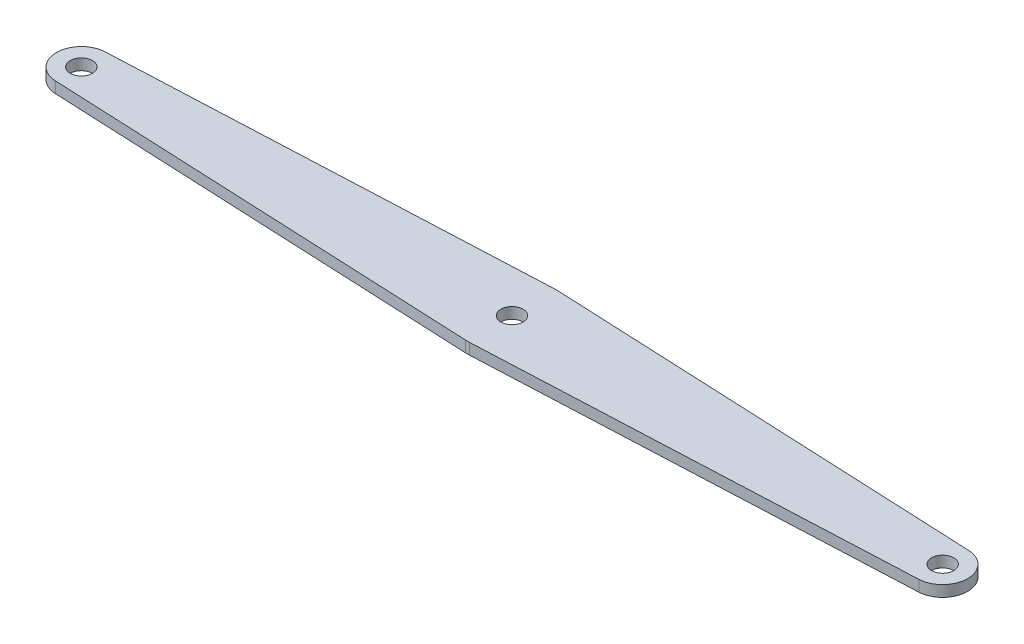
ISO-10303-21;
HEADER;
FILE_DESCRIPTION(('STEP AP214'),'2;1');
FILE_NAME('part.step','',(''),(''),'','','');
FILE_SCHEMA(('AUTOMOTIVE_DESIGN { 1 0 10303 214 1 1 1 1 }'));
ENDSEC;
DATA;
#1=APPLICATION_CONTEXT('core data for automotive mechanical design processes');
#2=APPLICATION_PROTOCOL_DEFINITION('international standard','automotive_design',2000,#1);
#3=PRODUCT_CONTEXT('',#1,'mechanical');
#4=PRODUCT('Part','Part','',(#3));
#5=PRODUCT_RELATED_PRODUCT_CATEGORY('part','',(#4));
#6=PRODUCT_DEFINITION_FORMATION('','',#4);
#7=PRODUCT_DEFINITION_CONTEXT('part definition',#1,'design');
#8=PRODUCT_DEFINITION('design','',#6,#7);
#9=PRODUCT_DEFINITION_SHAPE('','',#8);
#10=(LENGTH_UNIT() NAMED_UNIT(*) SI_UNIT(.MILLI.,.METRE.));
#11=(NAMED_UNIT(*) PLANE_ANGLE_UNIT() SI_UNIT($,.RADIAN.));
#12=(NAMED_UNIT(*) SI_UNIT($,.STERADIAN.) SOLID_ANGLE_UNIT());
#13=UNCERTAINTY_MEASURE_WITH_UNIT(LENGTH_MEASURE(1.E-05),#10,'distance_accuracy_value','');
#14=(GEOMETRIC_REPRESENTATION_CONTEXT(3) GLOBAL_UNCERTAINTY_ASSIGNED_CONTEXT((#13)) GLOBAL_UNIT_ASSIGNED_CONTEXT((#10,
#11,#12)) REPRESENTATION_CONTEXT('',''));
#15=CARTESIAN_POINT('',(0.,0.,0.));
#16=DIRECTION('',(0.,0.,1.));
#17=DIRECTION('',(1.,0.,0.));
#18=AXIS2_PLACEMENT_3D('',#15,#16,#17);
#19=CARTESIAN_POINT('',(-77.5,2.,0.));
#20=DIRECTION('',(0.,-1.,0.));
#21=DIRECTION('',(0.,0.,-1.));
#22=AXIS2_PLACEMENT_3D('',#19,#20,#21);
#23=CYLINDRICAL_SURFACE('',#22,4.5);
#24=CARTESIAN_POINT('',(-77.5,0.,0.));
#25=DIRECTION('',(0.,1.,0.));
#26=DIRECTION('',(0.,0.,1.));
#27=AXIS2_PLACEMENT_3D('',#24,#25,#26);
#28=CIRCLE('',#27,4.5);
#29=CARTESIAN_POINT('',(-77.7032258064516,0.,-4.49540868793841));
#30=VERTEX_POINT('',#29);
#31=CARTESIAN_POINT('',(-77.7032258064516,0.,4.49540868793841));
#32=VERTEX_POINT('',#31);
#33=EDGE_CURVE('E137',#30,#32,#28,.T.);
#34=ORIENTED_EDGE('',*,*,#33,.T.);
#35=DIRECTION('',(0.,-1.,0.));
#36=VECTOR('',#35,1.);
#37=CARTESIAN_POINT('',(-77.7032258064516,2.,4.49540868793841));
#38=LINE('',#37,#36);
#39=CARTESIAN_POINT('',(-77.7032258064516,2.,4.49540868793841));
#40=VERTEX_POINT('',#39);
#41=EDGE_CURVE('E11',#40,#32,#38,.T.);
#42=ORIENTED_EDGE('',*,*,#41,.F.);
#43=CARTESIAN_POINT('',(-77.5,2.,0.));
#44=DIRECTION('',(0.,1.,0.));
#45=DIRECTION('',(0.,0.,1.));
#46=AXIS2_PLACEMENT_3D('',#43,#44,#45);
#47=CIRCLE('',#46,4.5);
#48=CARTESIAN_POINT('',(-77.7032258064516,2.,-4.49540868793841));
#49=VERTEX_POINT('',#48);
#50=EDGE_CURVE('E152',#49,#40,#47,.T.);
#51=ORIENTED_EDGE('',*,*,#50,.F.);
#52=DIRECTION('',(0.,-1.,0.));
#53=VECTOR('',#52,1.);
#54=CARTESIAN_POINT('',(-77.7032258064516,2.,-4.49540868793841));
#55=LINE('',#54,#53);
#56=EDGE_CURVE('E133',#49,#30,#55,.T.);
#57=ORIENTED_EDGE('',*,*,#56,.T.);
#58=EDGE_LOOP('',(#34,#42,#51,#57));
#59=FACE_BOUND('',#58,.T.);
#60=ADVANCED_FACE('F41',(#59),#23,.T.);
#61=CARTESIAN_POINT('',(-77.7032258064516,2.,4.49540868793841));
#62=DIRECTION('',(0.0451612903225806,0.,-0.998979708430757));
#63=DIRECTION('',(-0.998979708430757,0.,-0.0451612903225806));
#64=AXIS2_PLACEMENT_3D('',#61,#62,#63);
#65=PLANE('',#64);
#66=DIRECTION('',(0.998979708430757,0.,0.0451612903225806));
#67=VECTOR('',#66,1.);
#68=CARTESIAN_POINT('',(-77.7032258064516,0.,4.49540868793841));
#69=LINE('',#68,#67);
#70=CARTESIAN_POINT('',(-0.361290322580645,0.,7.99183766744605));
#71=VERTEX_POINT('',#70);
#72=EDGE_CURVE('E140',#32,#71,#69,.T.);
#73=ORIENTED_EDGE('',*,*,#72,.T.);
#74=DIRECTION('',(0.,-1.,0.));
#75=VECTOR('',#74,1.);
#76=CARTESIAN_POINT('',(-0.361290322580645,2.,7.99183766744605));
#77=LINE('',#76,#75);
#78=CARTESIAN_POINT('',(-0.361290322580645,2.,7.99183766744605));
#79=VERTEX_POINT('',#78);
#80=EDGE_CURVE('E49',#79,#71,#77,.T.);
#81=ORIENTED_EDGE('',*,*,#80,.F.);
#82=DIRECTION('',(0.998979708430757,0.,0.0451612903225806));
#83=VECTOR('',#82,1.);
#84=CARTESIAN_POINT('',(-77.7032258064516,2.,4.49540868793841));
#85=LINE('',#84,#83);
#86=EDGE_CURVE('E100',#40,#79,#85,.T.);
#87=ORIENTED_EDGE('',*,*,#86,.F.);
#88=ORIENTED_EDGE('',*,*,#41,.T.);
#89=EDGE_LOOP('',(#73,#81,#87,#88));
#90=FACE_BOUND('',#89,.T.);
#91=ADVANCED_FACE('F233',(#90),#65,.F.);
#92=CARTESIAN_POINT('',(-0.361290322580645,2.,7.99183766744605));
#93=DIRECTION('',(0.,0.,-1.));
#94=DIRECTION('',(-1.,0.,0.));
#95=AXIS2_PLACEMENT_3D('',#92,#93,#94);
#96=PLANE('',#95);
#97=DIRECTION('',(1.,0.,0.));
#98=VECTOR('',#97,1.);
#99=CARTESIAN_POINT('',(-0.361290322580645,0.,7.99183766744605));
#100=LINE('',#99,#98);
#101=CARTESIAN_POINT('',(0.361290322580645,0.,7.99183766744605));
#102=VERTEX_POINT('',#101);
#103=EDGE_CURVE('E143',#71,#102,#100,.T.);
#104=ORIENTED_EDGE('',*,*,#103,.T.);
#105=DIRECTION('',(0.,-1.,0.));
#106=VECTOR('',#105,1.);
#107=CARTESIAN_POINT('',(0.361290322580645,2.,7.99183766744605));
#108=LINE('',#107,#106);
#109=CARTESIAN_POINT('',(0.361290322580645,2.,7.99183766744605));
#110=VERTEX_POINT('',#109);
#111=EDGE_CURVE('E159',#110,#102,#108,.T.);
#112=ORIENTED_EDGE('',*,*,#111,.F.);
#113=DIRECTION('',(1.,0.,0.));
#114=VECTOR('',#113,1.);
#115=CARTESIAN_POINT('',(-0.361290322580645,2.,7.99183766744605));
#116=LINE('',#115,#114);
#117=EDGE_CURVE('E167',#79,#110,#116,.T.);
#118=ORIENTED_EDGE('',*,*,#117,.F.);
#119=ORIENTED_EDGE('',*,*,#80,.T.);
#120=EDGE_LOOP('',(#104,#112,#118,#119));
#121=FACE_BOUND('',#120,.T.);
#122=ADVANCED_FACE('F165',(#121),#96,.F.);
#123=CARTESIAN_POINT('',(77.7032258064516,2.,4.49540868793841));
#124=DIRECTION('',(-0.0451612903225806,0.,-0.998979708430757));
#125=DIRECTION('',(-0.998979708430757,0.,0.0451612903225806));
#126=AXIS2_PLACEMENT_3D('',#123,#124,#125);
#127=PLANE('',#126);
#128=DIRECTION('',(0.998979708430757,0.,-0.0451612903225806));
#129=VECTOR('',#128,1.);
#130=CARTESIAN_POINT('',(77.7032258064516,0.,4.49540868793841));
#131=LINE('',#130,#129);
#132=CARTESIAN_POINT('',(77.7032258064516,0.,4.49540868793841));
#133=VERTEX_POINT('',#132);
#134=EDGE_CURVE('E145',#102,#133,#131,.T.);
#135=ORIENTED_EDGE('',*,*,#134,.T.);
#136=DIRECTION('',(0.,-1.,0.));
#137=VECTOR('',#136,1.);
#138=CARTESIAN_POINT('',(77.7032258064516,2.,4.49540868793841));
#139=LINE('',#138,#137);
#140=CARTESIAN_POINT('',(77.7032258064516,2.,4.49540868793841));
#141=VERTEX_POINT('',#140);
#142=EDGE_CURVE('E156',#141,#133,#139,.T.);
#143=ORIENTED_EDGE('',*,*,#142,.F.);
#144=DIRECTION('',(0.998979708430757,0.,-0.0451612903225806));
#145=VECTOR('',#144,1.);
#146=CARTESIAN_POINT('',(77.7032258064516,2.,4.49540868793841));
#147=LINE('',#146,#145);
#148=EDGE_CURVE('E179',#110,#141,#147,.T.);
#149=ORIENTED_EDGE('',*,*,#148,.F.);
#150=ORIENTED_EDGE('',*,*,#111,.T.);
#151=EDGE_LOOP('',(#135,#143,#149,#150));
#152=FACE_BOUND('',#151,.T.);
#153=ADVANCED_FACE('F175',(#152),#127,.F.);
#154=CARTESIAN_POINT('',(77.5,2.,0.));
#155=DIRECTION('',(0.,-1.,0.));
#156=DIRECTION('',(0.,0.,-1.));
#157=AXIS2_PLACEMENT_3D('',#154,#155,#156);
#158=CYLINDRICAL_SURFACE('',#157,4.5);
#159=CARTESIAN_POINT('',(77.5,0.,0.));
#160=DIRECTION('',(0.,1.,0.));
#161=DIRECTION('',(0.,0.,1.));
#162=AXIS2_PLACEMENT_3D('',#159,#160,#161);
#163=CIRCLE('',#162,4.5);
#164=CARTESIAN_POINT('',(77.7032258064516,0.,-4.49540868793841));
#165=VERTEX_POINT('',#164);
#166=EDGE_CURVE('E147',#133,#165,#163,.T.);
#167=ORIENTED_EDGE('',*,*,#166,.T.);
#168=DIRECTION('',(0.,-1.,0.));
#169=VECTOR('',#168,1.);
#170=CARTESIAN_POINT('',(77.7032258064516,2.,-4.49540868793841));
#171=LINE('',#170,#169);
#172=CARTESIAN_POINT('',(77.7032258064516,2.,-4.49540868793841));
#173=VERTEX_POINT('',#172);
#174=EDGE_CURVE('E128',#173,#165,#171,.T.);
#175=ORIENTED_EDGE('',*,*,#174,.F.);
#176=CARTESIAN_POINT('',(77.5,2.,0.));
#177=DIRECTION('',(0.,1.,0.));
#178=DIRECTION('',(0.,0.,1.));
#179=AXIS2_PLACEMENT_3D('',#176,#177,#178);
#180=CIRCLE('',#179,4.5);
#181=EDGE_CURVE('E119',#141,#173,#180,.T.);
#182=ORIENTED_EDGE('',*,*,#181,.F.);
#183=ORIENTED_EDGE('',*,*,#142,.T.);
#184=EDGE_LOOP('',(#167,#175,#182,#183));
#185=FACE_BOUND('',#184,.T.);
#186=ADVANCED_FACE('F178',(#185),#158,.T.);
#187=CARTESIAN_POINT('',(0.361290322580645,2.,-7.99183766744605));
#188=DIRECTION('',(-0.0451612903225806,0.,0.998979708430757));
#189=DIRECTION('',(0.998979708430757,0.,0.0451612903225806));
#190=AXIS2_PLACEMENT_3D('',#187,#188,#189);
#191=PLANE('',#190);
#192=DIRECTION('',(-0.998979708430757,0.,-0.0451612903225806));
#193=VECTOR('',#192,1.);
#194=CARTESIAN_POINT('',(0.361290322580645,0.,-7.99183766744605));
#195=LINE('',#194,#193);
#196=CARTESIAN_POINT('',(0.361290322580645,0.,-7.99183766744605));
#197=VERTEX_POINT('',#196);
#198=EDGE_CURVE('E127',#165,#197,#195,.T.);
#199=ORIENTED_EDGE('',*,*,#198,.T.);
#200=DIRECTION('',(0.,-1.,0.));
#201=VECTOR('',#200,1.);
#202=CARTESIAN_POINT('',(0.361290322580645,2.,-7.99183766744605));
#203=LINE('',#202,#201);
#204=CARTESIAN_POINT('',(0.361290322580645,2.,-7.99183766744605));
#205=VERTEX_POINT('',#204);
#206=EDGE_CURVE('E124',#205,#197,#203,.T.);
#207=ORIENTED_EDGE('',*,*,#206,.F.);
#208=DIRECTION('',(-0.998979708430757,0.,-0.0451612903225806));
#209=VECTOR('',#208,1.);
#210=CARTESIAN_POINT('',(0.361290322580645,2.,-7.99183766744605));
#211=LINE('',#210,#209);
#212=EDGE_CURVE('E113',#173,#205,#211,.T.);
#213=ORIENTED_EDGE('',*,*,#212,.F.);
#214=ORIENTED_EDGE('',*,*,#174,.T.);
#215=EDGE_LOOP('',(#199,#207,#213,#214));
#216=FACE_BOUND('',#215,.T.);
#217=ADVANCED_FACE('F125',(#216),#191,.F.);
#218=CARTESIAN_POINT('',(-0.361290322580645,2.,-7.99183766744605));
#219=DIRECTION('',(0.,0.,1.));
#220=DIRECTION('',(1.,0.,0.));
#221=AXIS2_PLACEMENT_3D('',#218,#219,#220);
#222=PLANE('',#221);
#223=DIRECTION('',(-1.,0.,0.));
#224=VECTOR('',#223,1.);
#225=CARTESIAN_POINT('',(-0.361290322580645,0.,-7.99183766744605));
#226=LINE('',#225,#224);
#227=CARTESIAN_POINT('',(-0.361290322580645,0.,-7.99183766744605));
#228=VERTEX_POINT('',#227);
#229=EDGE_CURVE('E86',#197,#228,#226,.T.);
#230=ORIENTED_EDGE('',*,*,#229,.T.);
#231=DIRECTION('',(0.,-1.,0.));
#232=VECTOR('',#231,1.);
#233=CARTESIAN_POINT('',(-0.361290322580645,2.,-7.99183766744605));
#234=LINE('',#233,#232);
#235=CARTESIAN_POINT('',(-0.361290322580645,2.,-7.99183766744605));
#236=VERTEX_POINT('',#235);
#237=EDGE_CURVE('E129',#236,#228,#234,.T.);
#238=ORIENTED_EDGE('',*,*,#237,.F.);
#239=DIRECTION('',(-1.,0.,0.));
#240=VECTOR('',#239,1.);
#241=CARTESIAN_POINT('',(-0.361290322580645,2.,-7.99183766744605));
#242=LINE('',#241,#240);
#243=EDGE_CURVE('E117',#205,#236,#242,.T.);
#244=ORIENTED_EDGE('',*,*,#243,.F.);
#245=ORIENTED_EDGE('',*,*,#206,.T.);
#246=EDGE_LOOP('',(#230,#238,#244,#245));
#247=FACE_BOUND('',#246,.T.);
#248=ADVANCED_FACE('F131',(#247),#222,.F.);
#249=CARTESIAN_POINT('',(-77.7032258064516,2.,-4.49540868793841));
#250=DIRECTION('',(0.0451612903225806,0.,0.998979708430757));
#251=DIRECTION('',(0.998979708430757,0.,-0.0451612903225806));
#252=AXIS2_PLACEMENT_3D('',#249,#250,#251);
#253=PLANE('',#252);
#254=DIRECTION('',(-0.998979708430757,0.,0.0451612903225806));
#255=VECTOR('',#254,1.);
#256=CARTESIAN_POINT('',(-77.7032258064516,0.,-4.49540868793841));
#257=LINE('',#256,#255);
#258=EDGE_CURVE('E92',#228,#30,#257,.T.);
#259=ORIENTED_EDGE('',*,*,#258,.T.);
#260=ORIENTED_EDGE('',*,*,#56,.F.);
#261=DIRECTION('',(-0.998979708430757,0.,0.0451612903225806));
#262=VECTOR('',#261,1.);
#263=CARTESIAN_POINT('',(-77.7032258064516,2.,-4.49540868793841));
#264=LINE('',#263,#262);
#265=EDGE_CURVE('E57',#236,#49,#264,.T.);
#266=ORIENTED_EDGE('',*,*,#265,.F.);
#267=ORIENTED_EDGE('',*,*,#237,.T.);
#268=EDGE_LOOP('',(#259,#260,#266,#267));
#269=FACE_BOUND('',#268,.T.);
#270=ADVANCED_FACE('F214',(#269),#253,.F.);
#271=CARTESIAN_POINT('',(-77.5,2.,0.));
#272=DIRECTION('',(0.,1.,0.));
#273=DIRECTION('',(0.,0.,1.));
#274=AXIS2_PLACEMENT_3D('',#271,#272,#273);
#275=PLANE('',#274);
#276=CARTESIAN_POINT('',(77.5,2.,0.));
#277=DIRECTION('',(0.,1.,0.));
#278=DIRECTION('',(0.,0.,1.));
#279=AXIS2_PLACEMENT_3D('',#276,#277,#278);
#280=CIRCLE('',#279,2.);
#281=CARTESIAN_POINT('',(77.5,2.,2.));
#282=VERTEX_POINT('',#281);
#283=EDGE_CURVE('E197',#282,#282,#280,.T.);
#284=ORIENTED_EDGE('',*,*,#283,.F.);
#285=EDGE_LOOP('',(#284));
#286=FACE_BOUND('',#285,.T.);
#287=CARTESIAN_POINT('',(-77.5,2.,0.));
#288=DIRECTION('',(0.,1.,0.));
#289=DIRECTION('',(0.,0.,1.));
#290=AXIS2_PLACEMENT_3D('',#287,#288,#289);
#291=CIRCLE('',#290,2.);
#292=CARTESIAN_POINT('',(-77.5,2.,2.));
#293=VERTEX_POINT('',#292);
#294=EDGE_CURVE('E191',#293,#293,#291,.T.);
#295=ORIENTED_EDGE('',*,*,#294,.F.);
#296=EDGE_LOOP('',(#295));
#297=FACE_BOUND('',#296,.T.);
#298=CARTESIAN_POINT('',(0.,2.,0.));
#299=DIRECTION('',(0.,1.,0.));
#300=DIRECTION('',(0.,0.,1.));
#301=AXIS2_PLACEMENT_3D('',#298,#299,#300);
#302=CIRCLE('',#301,2.);
#303=CARTESIAN_POINT('',(0.,2.,2.));
#304=VERTEX_POINT('',#303);
#305=EDGE_CURVE('E185',#304,#304,#302,.T.);
#306=ORIENTED_EDGE('',*,*,#305,.F.);
#307=EDGE_LOOP('',(#306));
#308=FACE_BOUND('',#307,.T.);
#309=ORIENTED_EDGE('',*,*,#50,.T.);
#310=ORIENTED_EDGE('',*,*,#86,.T.);
#311=ORIENTED_EDGE('',*,*,#117,.T.);
#312=ORIENTED_EDGE('',*,*,#148,.T.);
#313=ORIENTED_EDGE('',*,*,#181,.T.);
#314=ORIENTED_EDGE('',*,*,#212,.T.);
#315=ORIENTED_EDGE('',*,*,#243,.T.);
#316=ORIENTED_EDGE('',*,*,#265,.T.);
#317=EDGE_LOOP('',(#309,#310,#311,#312,#313,#314,#315,#316));
#318=FACE_BOUND('',#317,.T.);
#319=ADVANCED_FACE('F115',(#286,#297,#308,#318),#275,.T.);
#320=CARTESIAN_POINT('',(-77.5,0.,0.));
#321=DIRECTION('',(0.,1.,0.));
#322=DIRECTION('',(0.,0.,1.));
#323=AXIS2_PLACEMENT_3D('',#320,#321,#322);
#324=PLANE('',#323);
#325=CARTESIAN_POINT('',(77.5,0.,0.));
#326=DIRECTION('',(0.,1.,0.));
#327=DIRECTION('',(0.,0.,1.));
#328=AXIS2_PLACEMENT_3D('',#325,#326,#327);
#329=CIRCLE('',#328,2.);
#330=CARTESIAN_POINT('',(77.5,0.,2.));
#331=VERTEX_POINT('',#330);
#332=EDGE_CURVE('E194',#331,#331,#329,.T.);
#333=ORIENTED_EDGE('',*,*,#332,.T.);
#334=EDGE_LOOP('',(#333));
#335=FACE_BOUND('',#334,.T.);
#336=CARTESIAN_POINT('',(-77.5,0.,0.));
#337=DIRECTION('',(0.,1.,0.));
#338=DIRECTION('',(0.,0.,1.));
#339=AXIS2_PLACEMENT_3D('',#336,#337,#338);
#340=CIRCLE('',#339,2.);
#341=CARTESIAN_POINT('',(-77.5,0.,2.));
#342=VERTEX_POINT('',#341);
#343=EDGE_CURVE('E188',#342,#342,#340,.T.);
#344=ORIENTED_EDGE('',*,*,#343,.T.);
#345=EDGE_LOOP('',(#344));
#346=FACE_BOUND('',#345,.T.);
#347=CARTESIAN_POINT('',(0.,0.,0.));
#348=DIRECTION('',(0.,1.,0.));
#349=DIRECTION('',(0.,0.,1.));
#350=AXIS2_PLACEMENT_3D('',#347,#348,#349);
#351=CIRCLE('',#350,2.);
#352=CARTESIAN_POINT('',(0.,0.,2.));
#353=VERTEX_POINT('',#352);
#354=EDGE_CURVE('E141',#353,#353,#351,.T.);
#355=ORIENTED_EDGE('',*,*,#354,.T.);
#356=EDGE_LOOP('',(#355));
#357=FACE_BOUND('',#356,.T.);
#358=ORIENTED_EDGE('',*,*,#33,.F.);
#359=ORIENTED_EDGE('',*,*,#258,.F.);
#360=ORIENTED_EDGE('',*,*,#229,.F.);
#361=ORIENTED_EDGE('',*,*,#198,.F.);
#362=ORIENTED_EDGE('',*,*,#166,.F.);
#363=ORIENTED_EDGE('',*,*,#134,.F.);
#364=ORIENTED_EDGE('',*,*,#103,.F.);
#365=ORIENTED_EDGE('',*,*,#72,.F.);
#366=EDGE_LOOP('',(#358,#359,#360,#361,#362,#363,#364,#365));
#367=FACE_BOUND('',#366,.T.);
#368=ADVANCED_FACE('F171',(#335,#346,#357,#367),#324,.F.);
#369=CARTESIAN_POINT('',(0.,0.,0.));
#370=DIRECTION('',(0.,1.,0.));
#371=DIRECTION('',(0.,0.,1.));
#372=AXIS2_PLACEMENT_3D('',#369,#370,#371);
#373=CYLINDRICAL_SURFACE('',#372,2.);
#374=ORIENTED_EDGE('',*,*,#354,.F.);
#375=EDGE_LOOP('',(#374));
#376=FACE_BOUND('',#375,.T.);
#377=ORIENTED_EDGE('',*,*,#305,.T.);
#378=EDGE_LOOP('',(#377));
#379=FACE_BOUND('',#378,.T.);
#380=ADVANCED_FACE('F220',(#376,#379),#373,.F.);
#381=CARTESIAN_POINT('',(-77.5,0.,0.));
#382=DIRECTION('',(0.,1.,0.));
#383=DIRECTION('',(0.,0.,1.));
#384=AXIS2_PLACEMENT_3D('',#381,#382,#383);
#385=CYLINDRICAL_SURFACE('',#384,2.);
#386=ORIENTED_EDGE('',*,*,#343,.F.);
#387=EDGE_LOOP('',(#386));
#388=FACE_BOUND('',#387,.T.);
#389=ORIENTED_EDGE('',*,*,#294,.T.);
#390=EDGE_LOOP('',(#389));
#391=FACE_BOUND('',#390,.T.);
#392=ADVANCED_FACE('F208',(#388,#391),#385,.F.);
#393=CARTESIAN_POINT('',(77.5,0.,0.));
#394=DIRECTION('',(0.,1.,0.));
#395=DIRECTION('',(0.,0.,1.));
#396=AXIS2_PLACEMENT_3D('',#393,#394,#395);
#397=CYLINDRICAL_SURFACE('',#396,2.);
#398=ORIENTED_EDGE('',*,*,#332,.F.);
#399=EDGE_LOOP('',(#398));
#400=FACE_BOUND('',#399,.T.);
#401=ORIENTED_EDGE('',*,*,#283,.T.);
#402=EDGE_LOOP('',(#401));
#403=FACE_BOUND('',#402,.T.);
#404=ADVANCED_FACE('F205',(#400,#403),#397,.F.);
#405=CLOSED_SHELL('',(#60,#91,#122,#153,#186,#217,#248,#270,#319,#368,#380,#392,#404));
#406=MANIFOLD_SOLID_BREP('B2',#405);
#407=ADVANCED_BREP_SHAPE_REPRESENTATION('',(#18,#406),#14);
#408=SHAPE_DEFINITION_REPRESENTATION(#9,#407);
ENDSEC;
END-ISO-10303-21;
